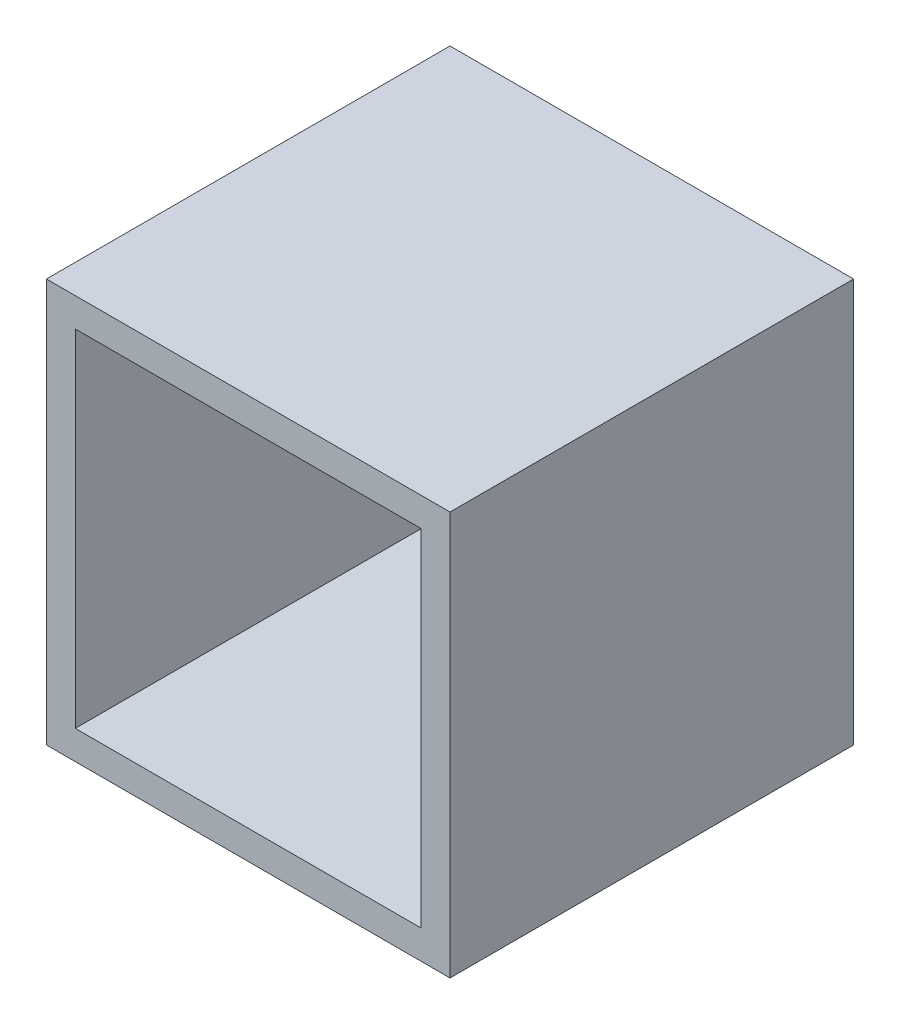
ISO-10303-21;
HEADER;
FILE_DESCRIPTION(('STEP AP214'),'2;1');
FILE_NAME('part.step','',(''),(''),'','','');
FILE_SCHEMA(('AUTOMOTIVE_DESIGN { 1 0 10303 214 1 1 1 1 }'));
ENDSEC;
DATA;
#1=APPLICATION_CONTEXT('core data for automotive mechanical design processes');
#2=APPLICATION_PROTOCOL_DEFINITION('international standard','automotive_design',2000,#1);
#3=PRODUCT_CONTEXT('',#1,'mechanical');
#4=PRODUCT('Part','Part','',(#3));
#5=PRODUCT_RELATED_PRODUCT_CATEGORY('part','',(#4));
#6=PRODUCT_DEFINITION_FORMATION('','',#4);
#7=PRODUCT_DEFINITION_CONTEXT('part definition',#1,'design');
#8=PRODUCT_DEFINITION('design','',#6,#7);
#9=PRODUCT_DEFINITION_SHAPE('','',#8);
#10=(LENGTH_UNIT() NAMED_UNIT(*) SI_UNIT(.MILLI.,.METRE.));
#11=(NAMED_UNIT(*) PLANE_ANGLE_UNIT() SI_UNIT($,.RADIAN.));
#12=(NAMED_UNIT(*) SI_UNIT($,.STERADIAN.) SOLID_ANGLE_UNIT());
#13=UNCERTAINTY_MEASURE_WITH_UNIT(LENGTH_MEASURE(1.E-05),#10,'distance_accuracy_value','');
#14=(GEOMETRIC_REPRESENTATION_CONTEXT(3) GLOBAL_UNCERTAINTY_ASSIGNED_CONTEXT((#13)) GLOBAL_UNIT_ASSIGNED_CONTEXT((#10,
#11,#12)) REPRESENTATION_CONTEXT('',''));
#15=CARTESIAN_POINT('',(0.,0.,0.));
#16=DIRECTION('',(0.,0.,1.));
#17=DIRECTION('',(1.,0.,0.));
#18=AXIS2_PLACEMENT_3D('',#15,#16,#17);
#19=CARTESIAN_POINT('',(-20.284904397773,20.560708190514,35.));
#20=DIRECTION('',(1.,0.,0.));
#21=DIRECTION('',(0.,1.,0.));
#22=AXIS2_PLACEMENT_3D('',#19,#20,#21);
#23=PLANE('',#22);
#24=DIRECTION('',(0.,0.,-1.));
#25=VECTOR('',#24,1.);
#26=CARTESIAN_POINT('',(-20.284904397773,20.560708190514,35.));
#27=LINE('',#26,#25);
#28=CARTESIAN_POINT('',(-20.284904397773,20.560708190514,35.));
#29=VERTEX_POINT('',#28);
#30=CARTESIAN_POINT('',(-20.284904397773,20.560708190514,0.));
#31=VERTEX_POINT('',#30);
#32=EDGE_CURVE('E79',#29,#31,#27,.T.);
#33=ORIENTED_EDGE('',*,*,#32,.T.);
#34=DIRECTION('',(0.,-1.,0.));
#35=VECTOR('',#34,1.);
#36=CARTESIAN_POINT('',(-20.284904397773,20.560708190514,0.));
#37=LINE('',#36,#35);
#38=CARTESIAN_POINT('',(-20.284904397773,-14.439291809486,0.));
#39=VERTEX_POINT('',#38);
#40=EDGE_CURVE('E143',#31,#39,#37,.T.);
#41=ORIENTED_EDGE('',*,*,#40,.T.);
#42=DIRECTION('',(0.,0.,-1.));
#43=VECTOR('',#42,1.);
#44=CARTESIAN_POINT('',(-20.284904397773,-14.439291809486,35.));
#45=LINE('',#44,#43);
#46=CARTESIAN_POINT('',(-20.284904397773,-14.439291809486,35.));
#47=VERTEX_POINT('',#46);
#48=EDGE_CURVE('E12',#47,#39,#45,.T.);
#49=ORIENTED_EDGE('',*,*,#48,.F.);
#50=DIRECTION('',(0.,-1.,0.));
#51=VECTOR('',#50,1.);
#52=CARTESIAN_POINT('',(-20.284904397773,20.560708190514,35.));
#53=LINE('',#52,#51);
#54=EDGE_CURVE('E147',#29,#47,#53,.T.);
#55=ORIENTED_EDGE('',*,*,#54,.F.);
#56=EDGE_LOOP('',(#33,#41,#49,#55));
#57=FACE_BOUND('',#56,.T.);
#58=ADVANCED_FACE('F36',(#57),#23,.F.);
#59=CARTESIAN_POINT('',(-20.284904397773,-14.439291809486,35.));
#60=DIRECTION('',(0.,1.,0.));
#61=DIRECTION('',(0.,0.,1.));
#62=AXIS2_PLACEMENT_3D('',#59,#60,#61);
#63=PLANE('',#62);
#64=ORIENTED_EDGE('',*,*,#48,.T.);
#65=DIRECTION('',(1.,0.,0.));
#66=VECTOR('',#65,1.);
#67=CARTESIAN_POINT('',(-20.284904397773,-14.439291809486,0.));
#68=LINE('',#67,#66);
#69=CARTESIAN_POINT('',(14.715095602227,-14.439291809486,0.));
#70=VERTEX_POINT('',#69);
#71=EDGE_CURVE('E155',#39,#70,#68,.T.);
#72=ORIENTED_EDGE('',*,*,#71,.T.);
#73=DIRECTION('',(0.,0.,-1.));
#74=VECTOR('',#73,1.);
#75=CARTESIAN_POINT('',(14.715095602227,-14.439291809486,35.));
#76=LINE('',#75,#74);
#77=CARTESIAN_POINT('',(14.715095602227,-14.439291809486,35.));
#78=VERTEX_POINT('',#77);
#79=EDGE_CURVE('E43',#78,#70,#76,.T.);
#80=ORIENTED_EDGE('',*,*,#79,.F.);
#81=DIRECTION('',(1.,0.,0.));
#82=VECTOR('',#81,1.);
#83=CARTESIAN_POINT('',(-20.284904397773,-14.439291809486,35.));
#84=LINE('',#83,#82);
#85=EDGE_CURVE('E86',#47,#78,#84,.T.);
#86=ORIENTED_EDGE('',*,*,#85,.F.);
#87=EDGE_LOOP('',(#64,#72,#80,#86));
#88=FACE_BOUND('',#87,.T.);
#89=ADVANCED_FACE('F171',(#88),#63,.F.);
#90=CARTESIAN_POINT('',(14.715095602227,20.560708190514,35.));
#91=DIRECTION('',(-1.,0.,0.));
#92=DIRECTION('',(0.,-1.,0.));
#93=AXIS2_PLACEMENT_3D('',#90,#91,#92);
#94=PLANE('',#93);
#95=ORIENTED_EDGE('',*,*,#79,.T.);
#96=DIRECTION('',(0.,1.,0.));
#97=VECTOR('',#96,1.);
#98=CARTESIAN_POINT('',(14.715095602227,20.560708190514,0.));
#99=LINE('',#98,#97);
#100=CARTESIAN_POINT('',(14.715095602227,20.560708190514,0.));
#101=VERTEX_POINT('',#100);
#102=EDGE_CURVE('E158',#70,#101,#99,.T.);
#103=ORIENTED_EDGE('',*,*,#102,.T.);
#104=DIRECTION('',(0.,0.,-1.));
#105=VECTOR('',#104,1.);
#106=CARTESIAN_POINT('',(14.715095602227,20.560708190514,35.));
#107=LINE('',#106,#105);
#108=CARTESIAN_POINT('',(14.715095602227,20.560708190514,35.));
#109=VERTEX_POINT('',#108);
#110=EDGE_CURVE('E163',#109,#101,#107,.T.);
#111=ORIENTED_EDGE('',*,*,#110,.F.);
#112=DIRECTION('',(0.,1.,0.));
#113=VECTOR('',#112,1.);
#114=CARTESIAN_POINT('',(14.715095602227,20.560708190514,35.));
#115=LINE('',#114,#113);
#116=EDGE_CURVE('E151',#78,#109,#115,.T.);
#117=ORIENTED_EDGE('',*,*,#116,.F.);
#118=EDGE_LOOP('',(#95,#103,#111,#117));
#119=FACE_BOUND('',#118,.T.);
#120=ADVANCED_FACE('F166',(#119),#94,.F.);
#121=CARTESIAN_POINT('',(-20.284904397773,20.560708190514,35.));
#122=DIRECTION('',(0.,-1.,0.));
#123=DIRECTION('',(0.,0.,-1.));
#124=AXIS2_PLACEMENT_3D('',#121,#122,#123);
#125=PLANE('',#124);
#126=ORIENTED_EDGE('',*,*,#110,.T.);
#127=DIRECTION('',(-1.,0.,0.));
#128=VECTOR('',#127,1.);
#129=CARTESIAN_POINT('',(-20.284904397773,20.560708190514,0.));
#130=LINE('',#129,#128);
#131=EDGE_CURVE('E149',#101,#31,#130,.T.);
#132=ORIENTED_EDGE('',*,*,#131,.T.);
#133=ORIENTED_EDGE('',*,*,#32,.F.);
#134=DIRECTION('',(-1.,0.,0.));
#135=VECTOR('',#134,1.);
#136=CARTESIAN_POINT('',(-20.284904397773,20.560708190514,35.));
#137=LINE('',#136,#135);
#138=EDGE_CURVE('E59',#109,#29,#137,.T.);
#139=ORIENTED_EDGE('',*,*,#138,.F.);
#140=EDGE_LOOP('',(#126,#132,#133,#139));
#141=FACE_BOUND('',#140,.T.);
#142=ADVANCED_FACE('F177',(#141),#125,.F.);
#143=CARTESIAN_POINT('',(0.,0.,35.));
#144=DIRECTION('',(0.,0.,1.));
#145=DIRECTION('',(1.,0.,0.));
#146=AXIS2_PLACEMENT_3D('',#143,#144,#145);
#147=PLANE('',#146);
#148=DIRECTION('',(1.,0.,0.));
#149=VECTOR('',#148,1.);
#150=CARTESIAN_POINT('',(-17.784904397773,-11.939291809486,35.));
#151=LINE('',#150,#149);
#152=CARTESIAN_POINT('',(-17.784904397773,-11.939291809486,35.));
#153=VERTEX_POINT('',#152);
#154=CARTESIAN_POINT('',(12.215095602227,-11.939291809486,35.));
#155=VERTEX_POINT('',#154);
#156=EDGE_CURVE('E50',#153,#155,#151,.T.);
#157=ORIENTED_EDGE('',*,*,#156,.F.);
#158=DIRECTION('',(0.,-1.,0.));
#159=VECTOR('',#158,1.);
#160=CARTESIAN_POINT('',(-17.784904397773,-11.939291809486,35.));
#161=LINE('',#160,#159);
#162=CARTESIAN_POINT('',(-17.784904397773,18.060708190514,35.));
#163=VERTEX_POINT('',#162);
#164=EDGE_CURVE('E128',#163,#153,#161,.T.);
#165=ORIENTED_EDGE('',*,*,#164,.F.);
#166=DIRECTION('',(-1.,0.,0.));
#167=VECTOR('',#166,1.);
#168=CARTESIAN_POINT('',(-17.784904397773,18.060708190514,35.));
#169=LINE('',#168,#167);
#170=CARTESIAN_POINT('',(12.215095602227,18.060708190514,35.));
#171=VERTEX_POINT('',#170);
#172=EDGE_CURVE('E131',#171,#163,#169,.T.);
#173=ORIENTED_EDGE('',*,*,#172,.F.);
#174=DIRECTION('',(0.,1.,0.));
#175=VECTOR('',#174,1.);
#176=CARTESIAN_POINT('',(12.215095602227,-11.939291809486,35.));
#177=LINE('',#176,#175);
#178=EDGE_CURVE('E137',#155,#171,#177,.T.);
#179=ORIENTED_EDGE('',*,*,#178,.F.);
#180=EDGE_LOOP('',(#157,#165,#173,#179));
#181=FACE_BOUND('',#180,.T.);
#182=ORIENTED_EDGE('',*,*,#54,.T.);
#183=ORIENTED_EDGE('',*,*,#85,.T.);
#184=ORIENTED_EDGE('',*,*,#116,.T.);
#185=ORIENTED_EDGE('',*,*,#138,.T.);
#186=EDGE_LOOP('',(#182,#183,#184,#185));
#187=FACE_BOUND('',#186,.T.);
#188=ADVANCED_FACE('F178',(#181,#187),#147,.T.);
#189=CARTESIAN_POINT('',(0.,0.,0.));
#190=DIRECTION('',(0.,0.,1.));
#191=DIRECTION('',(1.,0.,0.));
#192=AXIS2_PLACEMENT_3D('',#189,#190,#191);
#193=PLANE('',#192);
#194=ORIENTED_EDGE('',*,*,#40,.F.);
#195=ORIENTED_EDGE('',*,*,#131,.F.);
#196=ORIENTED_EDGE('',*,*,#102,.F.);
#197=ORIENTED_EDGE('',*,*,#71,.F.);
#198=EDGE_LOOP('',(#194,#195,#196,#197));
#199=FACE_BOUND('',#198,.T.);
#200=ADVANCED_FACE('F175',(#199),#193,.F.);
#201=CARTESIAN_POINT('',(-17.784904397773,-11.939291809486,2.5));
#202=DIRECTION('',(0.,-1.,0.));
#203=DIRECTION('',(0.,0.,-1.));
#204=AXIS2_PLACEMENT_3D('',#201,#202,#203);
#205=PLANE('',#204);
#206=ORIENTED_EDGE('',*,*,#156,.T.);
#207=DIRECTION('',(0.,0.,1.));
#208=VECTOR('',#207,1.);
#209=CARTESIAN_POINT('',(12.215095602227,-11.939291809486,2.5));
#210=LINE('',#209,#208);
#211=CARTESIAN_POINT('',(12.215095602227,-11.939291809486,2.5));
#212=VERTEX_POINT('',#211);
#213=EDGE_CURVE('E106',#212,#155,#210,.T.);
#214=ORIENTED_EDGE('',*,*,#213,.F.);
#215=DIRECTION('',(1.,0.,0.));
#216=VECTOR('',#215,1.);
#217=CARTESIAN_POINT('',(-17.784904397773,-11.939291809486,2.5));
#218=LINE('',#217,#216);
#219=CARTESIAN_POINT('',(-17.784904397773,-11.939291809486,2.5));
#220=VERTEX_POINT('',#219);
#221=EDGE_CURVE('E110',#220,#212,#218,.T.);
#222=ORIENTED_EDGE('',*,*,#221,.F.);
#223=DIRECTION('',(0.,0.,1.));
#224=VECTOR('',#223,1.);
#225=CARTESIAN_POINT('',(-17.784904397773,-11.939291809486,2.5));
#226=LINE('',#225,#224);
#227=EDGE_CURVE('E141',#220,#153,#226,.T.);
#228=ORIENTED_EDGE('',*,*,#227,.T.);
#229=EDGE_LOOP('',(#206,#214,#222,#228));
#230=FACE_BOUND('',#229,.T.);
#231=ADVANCED_FACE('F108',(#230),#205,.F.);
#232=CARTESIAN_POINT('',(-17.784904397773,-11.939291809486,2.5));
#233=DIRECTION('',(-1.,0.,0.));
#234=DIRECTION('',(0.,0.,1.));
#235=AXIS2_PLACEMENT_3D('',#232,#233,#234);
#236=PLANE('',#235);
#237=ORIENTED_EDGE('',*,*,#164,.T.);
#238=ORIENTED_EDGE('',*,*,#227,.F.);
#239=DIRECTION('',(0.,-1.,0.));
#240=VECTOR('',#239,1.);
#241=CARTESIAN_POINT('',(-17.784904397773,-11.939291809486,2.5));
#242=LINE('',#241,#240);
#243=CARTESIAN_POINT('',(-17.784904397773,18.060708190514,2.5));
#244=VERTEX_POINT('',#243);
#245=EDGE_CURVE('E116',#244,#220,#242,.T.);
#246=ORIENTED_EDGE('',*,*,#245,.F.);
#247=DIRECTION('',(0.,0.,1.));
#248=VECTOR('',#247,1.);
#249=CARTESIAN_POINT('',(-17.784904397773,18.060708190514,2.5));
#250=LINE('',#249,#248);
#251=EDGE_CURVE('E144',#244,#163,#250,.T.);
#252=ORIENTED_EDGE('',*,*,#251,.T.);
#253=EDGE_LOOP('',(#237,#238,#246,#252));
#254=FACE_BOUND('',#253,.T.);
#255=ADVANCED_FACE('F217',(#254),#236,.F.);
#256=CARTESIAN_POINT('',(-17.784904397773,18.060708190514,2.5));
#257=DIRECTION('',(0.,1.,0.));
#258=DIRECTION('',(-1.,0.,0.));
#259=AXIS2_PLACEMENT_3D('',#256,#257,#258);
#260=PLANE('',#259);
#261=ORIENTED_EDGE('',*,*,#172,.T.);
#262=ORIENTED_EDGE('',*,*,#251,.F.);
#263=DIRECTION('',(-1.,0.,0.));
#264=VECTOR('',#263,1.);
#265=CARTESIAN_POINT('',(-17.784904397773,18.060708190514,2.5));
#266=LINE('',#265,#264);
#267=CARTESIAN_POINT('',(12.215095602227,18.060708190514,2.5));
#268=VERTEX_POINT('',#267);
#269=EDGE_CURVE('E124',#268,#244,#266,.T.);
#270=ORIENTED_EDGE('',*,*,#269,.F.);
#271=DIRECTION('',(0.,0.,1.));
#272=VECTOR('',#271,1.);
#273=CARTESIAN_POINT('',(12.215095602227,18.060708190514,2.5));
#274=LINE('',#273,#272);
#275=EDGE_CURVE('E115',#268,#171,#274,.T.);
#276=ORIENTED_EDGE('',*,*,#275,.T.);
#277=EDGE_LOOP('',(#261,#262,#270,#276));
#278=FACE_BOUND('',#277,.T.);
#279=ADVANCED_FACE('F225',(#278),#260,.F.);
#280=CARTESIAN_POINT('',(12.215095602227,-11.939291809486,2.5));
#281=DIRECTION('',(1.,0.,0.));
#282=DIRECTION('',(0.,1.,0.));
#283=AXIS2_PLACEMENT_3D('',#280,#281,#282);
#284=PLANE('',#283);
#285=ORIENTED_EDGE('',*,*,#178,.T.);
#286=ORIENTED_EDGE('',*,*,#275,.F.);
#287=DIRECTION('',(0.,1.,0.));
#288=VECTOR('',#287,1.);
#289=CARTESIAN_POINT('',(12.215095602227,-11.939291809486,2.5));
#290=LINE('',#289,#288);
#291=EDGE_CURVE('E119',#212,#268,#290,.T.);
#292=ORIENTED_EDGE('',*,*,#291,.F.);
#293=ORIENTED_EDGE('',*,*,#213,.T.);
#294=EDGE_LOOP('',(#285,#286,#292,#293));
#295=FACE_BOUND('',#294,.T.);
#296=ADVANCED_FACE('F120',(#295),#284,.F.);
#297=CARTESIAN_POINT('',(0.,0.,2.5));
#298=DIRECTION('',(0.,0.,1.));
#299=DIRECTION('',(1.,0.,0.));
#300=AXIS2_PLACEMENT_3D('',#297,#298,#299);
#301=PLANE('',#300);
#302=ORIENTED_EDGE('',*,*,#221,.T.);
#303=ORIENTED_EDGE('',*,*,#291,.T.);
#304=ORIENTED_EDGE('',*,*,#269,.T.);
#305=ORIENTED_EDGE('',*,*,#245,.T.);
#306=EDGE_LOOP('',(#302,#303,#304,#305));
#307=FACE_BOUND('',#306,.T.);
#308=ADVANCED_FACE('F126',(#307),#301,.T.);
#309=CLOSED_SHELL('',(#58,#89,#120,#142,#188,#200,#231,#255,#279,#296,#308));
#310=MANIFOLD_SOLID_BREP('B2',#309);
#311=ADVANCED_BREP_SHAPE_REPRESENTATION('',(#18,#310),#14);
#312=SHAPE_DEFINITION_REPRESENTATION(#9,#311);
ENDSEC;
END-ISO-10303-21;
